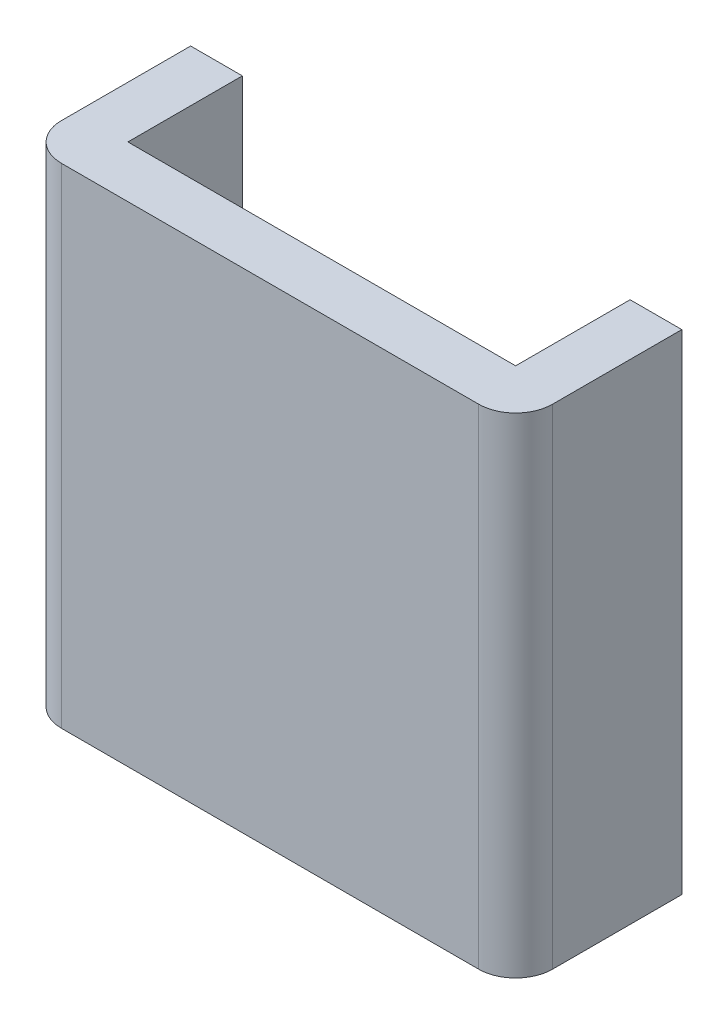
ISO-10303-21;
HEADER;
FILE_DESCRIPTION(('STEP AP214'),'2;1');
FILE_NAME('part.step','',(''),(''),'','','');
FILE_SCHEMA(('AUTOMOTIVE_DESIGN { 1 0 10303 214 1 1 1 1 }'));
ENDSEC;
DATA;
#1=APPLICATION_CONTEXT('core data for automotive mechanical design processes');
#2=APPLICATION_PROTOCOL_DEFINITION('international standard','automotive_design',2000,#1);
#3=PRODUCT_CONTEXT('',#1,'mechanical');
#4=PRODUCT('Part','Part','',(#3));
#5=PRODUCT_RELATED_PRODUCT_CATEGORY('part','',(#4));
#6=PRODUCT_DEFINITION_FORMATION('','',#4);
#7=PRODUCT_DEFINITION_CONTEXT('part definition',#1,'design');
#8=PRODUCT_DEFINITION('design','',#6,#7);
#9=PRODUCT_DEFINITION_SHAPE('','',#8);
#10=(LENGTH_UNIT() NAMED_UNIT(*) SI_UNIT(.MILLI.,.METRE.));
#11=(NAMED_UNIT(*) PLANE_ANGLE_UNIT() SI_UNIT($,.RADIAN.));
#12=(NAMED_UNIT(*) SI_UNIT($,.STERADIAN.) SOLID_ANGLE_UNIT());
#13=UNCERTAINTY_MEASURE_WITH_UNIT(LENGTH_MEASURE(1.E-05),#10,'distance_accuracy_value','');
#14=(GEOMETRIC_REPRESENTATION_CONTEXT(3) GLOBAL_UNCERTAINTY_ASSIGNED_CONTEXT((#13)) GLOBAL_UNIT_ASSIGNED_CONTEXT((#10,
#11,#12)) REPRESENTATION_CONTEXT('',''));
#15=CARTESIAN_POINT('',(0.,0.,0.));
#16=DIRECTION('',(0.,0.,1.));
#17=DIRECTION('',(1.,0.,0.));
#18=AXIS2_PLACEMENT_3D('',#15,#16,#17);
#19=CARTESIAN_POINT('',(13.3,26.5,0.));
#20=DIRECTION('',(-1.,0.,0.));
#21=DIRECTION('',(0.,0.,1.));
#22=AXIS2_PLACEMENT_3D('',#19,#20,#21);
#23=PLANE('',#22);
#24=DIRECTION('',(0.,0.,-1.));
#25=VECTOR('',#24,1.);
#26=CARTESIAN_POINT('',(13.3,26.5,0.));
#27=LINE('',#26,#25);
#28=CARTESIAN_POINT('',(13.3,26.5,-2.));
#29=VERTEX_POINT('',#28);
#30=CARTESIAN_POINT('',(13.3,26.5,-9.));
#31=VERTEX_POINT('',#30);
#32=EDGE_CURVE('E113',#29,#31,#27,.T.);
#33=ORIENTED_EDGE('',*,*,#32,.F.);
#34=DIRECTION('',(0.,-1.,0.));
#35=VECTOR('',#34,1.);
#36=CARTESIAN_POINT('',(13.3,26.5,-2.));
#37=LINE('',#36,#35);
#38=CARTESIAN_POINT('',(13.3,0.,-2.));
#39=VERTEX_POINT('',#38);
#40=EDGE_CURVE('E137',#29,#39,#37,.T.);
#41=ORIENTED_EDGE('',*,*,#40,.T.);
#42=DIRECTION('',(0.,0.,-1.));
#43=VECTOR('',#42,1.);
#44=CARTESIAN_POINT('',(13.3,0.,0.));
#45=LINE('',#44,#43);
#46=CARTESIAN_POINT('',(13.3,0.,-9.));
#47=VERTEX_POINT('',#46);
#48=EDGE_CURVE('E135',#39,#47,#45,.T.);
#49=ORIENTED_EDGE('',*,*,#48,.T.);
#50=DIRECTION('',(0.,-1.,0.));
#51=VECTOR('',#50,1.);
#52=CARTESIAN_POINT('',(13.3,26.5,-9.));
#53=LINE('',#52,#51);
#54=EDGE_CURVE('E128',#31,#47,#53,.T.);
#55=ORIENTED_EDGE('',*,*,#54,.F.);
#56=EDGE_LOOP('',(#33,#41,#49,#55));
#57=FACE_BOUND('',#56,.T.);
#58=ADVANCED_FACE('F35',(#57),#23,.F.);
#59=CARTESIAN_POINT('',(13.3,26.5,-9.));
#60=DIRECTION('',(0.,0.,1.));
#61=DIRECTION('',(1.,0.,0.));
#62=AXIS2_PLACEMENT_3D('',#59,#60,#61);
#63=PLANE('',#62);
#64=DIRECTION('',(-1.,0.,0.));
#65=VECTOR('',#64,1.);
#66=CARTESIAN_POINT('',(13.3,0.,-9.));
#67=LINE('',#66,#65);
#68=CARTESIAN_POINT('',(10.5,0.,-9.));
#69=VERTEX_POINT('',#68);
#70=EDGE_CURVE('E197',#47,#69,#67,.T.);
#71=ORIENTED_EDGE('',*,*,#70,.T.);
#72=DIRECTION('',(0.,-1.,0.));
#73=VECTOR('',#72,1.);
#74=CARTESIAN_POINT('',(10.5,26.5,-9.));
#75=LINE('',#74,#73);
#76=CARTESIAN_POINT('',(10.5,26.5,-9.));
#77=VERTEX_POINT('',#76);
#78=EDGE_CURVE('E130',#77,#69,#75,.T.);
#79=ORIENTED_EDGE('',*,*,#78,.F.);
#80=DIRECTION('',(-1.,0.,0.));
#81=VECTOR('',#80,1.);
#82=CARTESIAN_POINT('',(13.3,26.5,-9.));
#83=LINE('',#82,#81);
#84=EDGE_CURVE('E116',#31,#77,#83,.T.);
#85=ORIENTED_EDGE('',*,*,#84,.F.);
#86=ORIENTED_EDGE('',*,*,#54,.T.);
#87=EDGE_LOOP('',(#71,#79,#85,#86));
#88=FACE_BOUND('',#87,.T.);
#89=ADVANCED_FACE('F127',(#88),#63,.F.);
#90=CARTESIAN_POINT('',(10.5,26.5,-9.));
#91=DIRECTION('',(1.,0.,0.));
#92=DIRECTION('',(0.,0.,-1.));
#93=AXIS2_PLACEMENT_3D('',#90,#91,#92);
#94=PLANE('',#93);
#95=DIRECTION('',(0.,0.,1.));
#96=VECTOR('',#95,1.);
#97=CARTESIAN_POINT('',(10.5,0.,-9.));
#98=LINE('',#97,#96);
#99=CARTESIAN_POINT('',(10.5,0.,-2.8));
#100=VERTEX_POINT('',#99);
#101=EDGE_CURVE('E195',#69,#100,#98,.T.);
#102=ORIENTED_EDGE('',*,*,#101,.T.);
#103=DIRECTION('',(0.,-1.,0.));
#104=VECTOR('',#103,1.);
#105=CARTESIAN_POINT('',(10.5,26.5,-2.8));
#106=LINE('',#105,#104);
#107=CARTESIAN_POINT('',(10.5,26.5,-2.8));
#108=VERTEX_POINT('',#107);
#109=EDGE_CURVE('E141',#108,#100,#106,.T.);
#110=ORIENTED_EDGE('',*,*,#109,.F.);
#111=DIRECTION('',(0.,0.,1.));
#112=VECTOR('',#111,1.);
#113=CARTESIAN_POINT('',(10.5,26.5,-9.));
#114=LINE('',#113,#112);
#115=EDGE_CURVE('E132',#77,#108,#114,.T.);
#116=ORIENTED_EDGE('',*,*,#115,.F.);
#117=ORIENTED_EDGE('',*,*,#78,.T.);
#118=EDGE_LOOP('',(#102,#110,#116,#117));
#119=FACE_BOUND('',#118,.T.);
#120=ADVANCED_FACE('F208',(#119),#94,.F.);
#121=CARTESIAN_POINT('',(10.5,26.5,-2.8));
#122=DIRECTION('',(0.,0.,1.));
#123=DIRECTION('',(1.,0.,0.));
#124=AXIS2_PLACEMENT_3D('',#121,#122,#123);
#125=PLANE('',#124);
#126=DIRECTION('',(-1.,0.,0.));
#127=VECTOR('',#126,1.);
#128=CARTESIAN_POINT('',(10.5,0.,-2.8));
#129=LINE('',#128,#127);
#130=CARTESIAN_POINT('',(-10.5,0.,-2.8));
#131=VERTEX_POINT('',#130);
#132=EDGE_CURVE('E190',#100,#131,#129,.T.);
#133=ORIENTED_EDGE('',*,*,#132,.T.);
#134=DIRECTION('',(0.,-1.,0.));
#135=VECTOR('',#134,1.);
#136=CARTESIAN_POINT('',(-10.5,26.5,-2.8));
#137=LINE('',#136,#135);
#138=CARTESIAN_POINT('',(-10.5,26.5,-2.8));
#139=VERTEX_POINT('',#138);
#140=EDGE_CURVE('E181',#139,#131,#137,.T.);
#141=ORIENTED_EDGE('',*,*,#140,.F.);
#142=DIRECTION('',(-1.,0.,0.));
#143=VECTOR('',#142,1.);
#144=CARTESIAN_POINT('',(10.5,26.5,-2.8));
#145=LINE('',#144,#143);
#146=EDGE_CURVE('E191',#108,#139,#145,.T.);
#147=ORIENTED_EDGE('',*,*,#146,.F.);
#148=ORIENTED_EDGE('',*,*,#109,.T.);
#149=EDGE_LOOP('',(#133,#141,#147,#148));
#150=FACE_BOUND('',#149,.T.);
#151=ADVANCED_FACE('F188',(#150),#125,.F.);
#152=CARTESIAN_POINT('',(-10.5,26.5,-2.8));
#153=DIRECTION('',(-1.,0.,0.));
#154=DIRECTION('',(0.,0.,1.));
#155=AXIS2_PLACEMENT_3D('',#152,#153,#154);
#156=PLANE('',#155);
#157=DIRECTION('',(0.,0.,-1.));
#158=VECTOR('',#157,1.);
#159=CARTESIAN_POINT('',(-10.5,0.,-2.8));
#160=LINE('',#159,#158);
#161=CARTESIAN_POINT('',(-10.5,0.,-9.));
#162=VERTEX_POINT('',#161);
#163=EDGE_CURVE('E173',#131,#162,#160,.T.);
#164=ORIENTED_EDGE('',*,*,#163,.T.);
#165=DIRECTION('',(0.,-1.,0.));
#166=VECTOR('',#165,1.);
#167=CARTESIAN_POINT('',(-10.5,26.5,-9.));
#168=LINE('',#167,#166);
#169=CARTESIAN_POINT('',(-10.5,26.5,-9.));
#170=VERTEX_POINT('',#169);
#171=EDGE_CURVE('E178',#170,#162,#168,.T.);
#172=ORIENTED_EDGE('',*,*,#171,.F.);
#173=DIRECTION('',(0.,0.,-1.));
#174=VECTOR('',#173,1.);
#175=CARTESIAN_POINT('',(-10.5,26.5,-2.8));
#176=LINE('',#175,#174);
#177=EDGE_CURVE('E205',#139,#170,#176,.T.);
#178=ORIENTED_EDGE('',*,*,#177,.F.);
#179=ORIENTED_EDGE('',*,*,#140,.T.);
#180=EDGE_LOOP('',(#164,#172,#178,#179));
#181=FACE_BOUND('',#180,.T.);
#182=ADVANCED_FACE('F215',(#181),#156,.F.);
#183=CARTESIAN_POINT('',(-10.5,26.5,-9.));
#184=DIRECTION('',(0.,0.,1.));
#185=DIRECTION('',(1.,0.,0.));
#186=AXIS2_PLACEMENT_3D('',#183,#184,#185);
#187=PLANE('',#186);
#188=DIRECTION('',(-1.,0.,0.));
#189=VECTOR('',#188,1.);
#190=CARTESIAN_POINT('',(-10.5,0.,-9.));
#191=LINE('',#190,#189);
#192=CARTESIAN_POINT('',(-13.3,0.,-9.));
#193=VERTEX_POINT('',#192);
#194=EDGE_CURVE('E170',#162,#193,#191,.T.);
#195=ORIENTED_EDGE('',*,*,#194,.T.);
#196=DIRECTION('',(0.,-1.,0.));
#197=VECTOR('',#196,1.);
#198=CARTESIAN_POINT('',(-13.3,26.5,-9.));
#199=LINE('',#198,#197);
#200=CARTESIAN_POINT('',(-13.3,26.5,-9.));
#201=VERTEX_POINT('',#200);
#202=EDGE_CURVE('E160',#201,#193,#199,.T.);
#203=ORIENTED_EDGE('',*,*,#202,.F.);
#204=DIRECTION('',(-1.,0.,0.));
#205=VECTOR('',#204,1.);
#206=CARTESIAN_POINT('',(-10.5,26.5,-9.));
#207=LINE('',#206,#205);
#208=EDGE_CURVE('E203',#170,#201,#207,.T.);
#209=ORIENTED_EDGE('',*,*,#208,.F.);
#210=ORIENTED_EDGE('',*,*,#171,.T.);
#211=EDGE_LOOP('',(#195,#203,#209,#210));
#212=FACE_BOUND('',#211,.T.);
#213=ADVANCED_FACE('F239',(#212),#187,.F.);
#214=CARTESIAN_POINT('',(-13.3,26.5,-9.));
#215=DIRECTION('',(1.,0.,0.));
#216=DIRECTION('',(0.,0.,-1.));
#217=AXIS2_PLACEMENT_3D('',#214,#215,#216);
#218=PLANE('',#217);
#219=DIRECTION('',(0.,0.,1.));
#220=VECTOR('',#219,1.);
#221=CARTESIAN_POINT('',(-13.3,0.,-9.));
#222=LINE('',#221,#220);
#223=CARTESIAN_POINT('',(-13.3,0.,-2.));
#224=VERTEX_POINT('',#223);
#225=EDGE_CURVE('E166',#193,#224,#222,.T.);
#226=ORIENTED_EDGE('',*,*,#225,.T.);
#227=DIRECTION('',(0.,-1.,0.));
#228=VECTOR('',#227,1.);
#229=CARTESIAN_POINT('',(-13.3,26.5,-2.));
#230=LINE('',#229,#228);
#231=CARTESIAN_POINT('',(-13.3,26.5,-2.));
#232=VERTEX_POINT('',#231);
#233=EDGE_CURVE('E11',#224,#232,#230,.F.);
#234=ORIENTED_EDGE('',*,*,#233,.T.);
#235=DIRECTION('',(0.,0.,1.));
#236=VECTOR('',#235,1.);
#237=CARTESIAN_POINT('',(-13.3,26.5,-9.));
#238=LINE('',#237,#236);
#239=EDGE_CURVE('E155',#201,#232,#238,.T.);
#240=ORIENTED_EDGE('',*,*,#239,.F.);
#241=ORIENTED_EDGE('',*,*,#202,.T.);
#242=EDGE_LOOP('',(#226,#234,#240,#241));
#243=FACE_BOUND('',#242,.T.);
#244=ADVANCED_FACE('F168',(#243),#218,.F.);
#245=CARTESIAN_POINT('',(-13.3,26.5,0.));
#246=DIRECTION('',(0.,0.,-1.));
#247=DIRECTION('',(-1.,0.,0.));
#248=AXIS2_PLACEMENT_3D('',#245,#246,#247);
#249=PLANE('',#248);
#250=DIRECTION('',(1.,0.,0.));
#251=VECTOR('',#250,1.);
#252=CARTESIAN_POINT('',(-13.3,0.,0.));
#253=LINE('',#252,#251);
#254=CARTESIAN_POINT('',(-11.3,0.,0.));
#255=VERTEX_POINT('',#254);
#256=CARTESIAN_POINT('',(11.3,0.,0.));
#257=VERTEX_POINT('',#256);
#258=EDGE_CURVE('E123',#255,#257,#253,.T.);
#259=ORIENTED_EDGE('',*,*,#258,.T.);
#260=DIRECTION('',(0.,-1.,0.));
#261=VECTOR('',#260,1.);
#262=CARTESIAN_POINT('',(11.3,26.5,0.));
#263=LINE('',#262,#261);
#264=CARTESIAN_POINT('',(11.3,26.5,0.));
#265=VERTEX_POINT('',#264);
#266=EDGE_CURVE('E56',#257,#265,#263,.F.);
#267=ORIENTED_EDGE('',*,*,#266,.T.);
#268=DIRECTION('',(1.,0.,0.));
#269=VECTOR('',#268,1.);
#270=CARTESIAN_POINT('',(-13.3,26.5,0.));
#271=LINE('',#270,#269);
#272=CARTESIAN_POINT('',(-11.3,26.5,0.));
#273=VERTEX_POINT('',#272);
#274=EDGE_CURVE('E154',#273,#265,#271,.T.);
#275=ORIENTED_EDGE('',*,*,#274,.F.);
#276=DIRECTION('',(0.,-1.,0.));
#277=VECTOR('',#276,1.);
#278=CARTESIAN_POINT('',(-11.3,26.5,0.));
#279=LINE('',#278,#277);
#280=EDGE_CURVE('E148',#273,#255,#279,.T.);
#281=ORIENTED_EDGE('',*,*,#280,.T.);
#282=EDGE_LOOP('',(#259,#267,#275,#281));
#283=FACE_BOUND('',#282,.T.);
#284=ADVANCED_FACE('F158',(#283),#249,.F.);
#285=CARTESIAN_POINT('',(0.,26.5,0.));
#286=DIRECTION('',(0.,1.,0.));
#287=DIRECTION('',(0.,0.,1.));
#288=AXIS2_PLACEMENT_3D('',#285,#286,#287);
#289=PLANE('',#288);
#290=ORIENTED_EDGE('',*,*,#274,.T.);
#291=CARTESIAN_POINT('',(11.3,26.5,-2.));
#292=DIRECTION('',(0.,1.,0.));
#293=DIRECTION('',(0.,0.,1.));
#294=AXIS2_PLACEMENT_3D('',#291,#292,#293);
#295=CIRCLE('',#294,2.);
#296=EDGE_CURVE('E43',#265,#29,#295,.T.);
#297=ORIENTED_EDGE('',*,*,#296,.T.);
#298=ORIENTED_EDGE('',*,*,#32,.T.);
#299=ORIENTED_EDGE('',*,*,#84,.T.);
#300=ORIENTED_EDGE('',*,*,#115,.T.);
#301=ORIENTED_EDGE('',*,*,#146,.T.);
#302=ORIENTED_EDGE('',*,*,#177,.T.);
#303=ORIENTED_EDGE('',*,*,#208,.T.);
#304=ORIENTED_EDGE('',*,*,#239,.T.);
#305=CARTESIAN_POINT('',(-11.3,26.5,-2.));
#306=DIRECTION('',(0.,1.,0.));
#307=DIRECTION('',(0.,0.,1.));
#308=AXIS2_PLACEMENT_3D('',#305,#306,#307);
#309=CIRCLE('',#308,2.);
#310=EDGE_CURVE('E152',#232,#273,#309,.T.);
#311=ORIENTED_EDGE('',*,*,#310,.T.);
#312=EDGE_LOOP('',(#290,#297,#298,#299,#300,#301,#302,#303,#304,#311));
#313=FACE_BOUND('',#312,.T.);
#314=ADVANCED_FACE('F115',(#313),#289,.T.);
#315=CARTESIAN_POINT('',(0.,0.,0.));
#316=DIRECTION('',(0.,1.,0.));
#317=DIRECTION('',(0.,0.,1.));
#318=AXIS2_PLACEMENT_3D('',#315,#316,#317);
#319=PLANE('',#318);
#320=ORIENTED_EDGE('',*,*,#48,.F.);
#321=CARTESIAN_POINT('',(11.3,0.,-2.));
#322=DIRECTION('',(0.,1.,0.));
#323=DIRECTION('',(0.,0.,1.));
#324=AXIS2_PLACEMENT_3D('',#321,#322,#323);
#325=CIRCLE('',#324,2.);
#326=EDGE_CURVE('E146',#39,#257,#325,.F.);
#327=ORIENTED_EDGE('',*,*,#326,.T.);
#328=ORIENTED_EDGE('',*,*,#258,.F.);
#329=CARTESIAN_POINT('',(-11.3,0.,-2.));
#330=DIRECTION('',(0.,1.,0.));
#331=DIRECTION('',(0.,0.,1.));
#332=AXIS2_PLACEMENT_3D('',#329,#330,#331);
#333=CIRCLE('',#332,2.);
#334=EDGE_CURVE('E139',#255,#224,#333,.F.);
#335=ORIENTED_EDGE('',*,*,#334,.T.);
#336=ORIENTED_EDGE('',*,*,#225,.F.);
#337=ORIENTED_EDGE('',*,*,#194,.F.);
#338=ORIENTED_EDGE('',*,*,#163,.F.);
#339=ORIENTED_EDGE('',*,*,#132,.F.);
#340=ORIENTED_EDGE('',*,*,#101,.F.);
#341=ORIENTED_EDGE('',*,*,#70,.F.);
#342=EDGE_LOOP('',(#320,#327,#328,#335,#336,#337,#338,#339,#340,#341));
#343=FACE_BOUND('',#342,.T.);
#344=ADVANCED_FACE('F164',(#343),#319,.F.);
#345=CARTESIAN_POINT('',(11.3,26.5,-2.));
#346=DIRECTION('',(0.,-1.,0.));
#347=DIRECTION('',(0.,0.,-1.));
#348=AXIS2_PLACEMENT_3D('',#345,#346,#347);
#349=CYLINDRICAL_SURFACE('',#348,2.);
#350=ORIENTED_EDGE('',*,*,#296,.F.);
#351=ORIENTED_EDGE('',*,*,#266,.F.);
#352=ORIENTED_EDGE('',*,*,#326,.F.);
#353=ORIENTED_EDGE('',*,*,#40,.F.);
#354=EDGE_LOOP('',(#350,#351,#352,#353));
#355=FACE_BOUND('',#354,.T.);
#356=ADVANCED_FACE('F222',(#355),#349,.T.);
#357=CARTESIAN_POINT('',(-11.3,26.5,-2.));
#358=DIRECTION('',(0.,-1.,0.));
#359=DIRECTION('',(0.,0.,-1.));
#360=AXIS2_PLACEMENT_3D('',#357,#358,#359);
#361=CYLINDRICAL_SURFACE('',#360,2.);
#362=ORIENTED_EDGE('',*,*,#310,.F.);
#363=ORIENTED_EDGE('',*,*,#233,.F.);
#364=ORIENTED_EDGE('',*,*,#334,.F.);
#365=ORIENTED_EDGE('',*,*,#280,.F.);
#366=EDGE_LOOP('',(#362,#363,#364,#365));
#367=FACE_BOUND('',#366,.T.);
#368=ADVANCED_FACE('F37',(#367),#361,.T.);
#369=CLOSED_SHELL('',(#58,#89,#120,#151,#182,#213,#244,#284,#314,#344,#356,#368));
#370=MANIFOLD_SOLID_BREP('B2',#369);
#371=ADVANCED_BREP_SHAPE_REPRESENTATION('',(#18,#370),#14);
#372=SHAPE_DEFINITION_REPRESENTATION(#9,#371);
ENDSEC;
END-ISO-10303-21;
